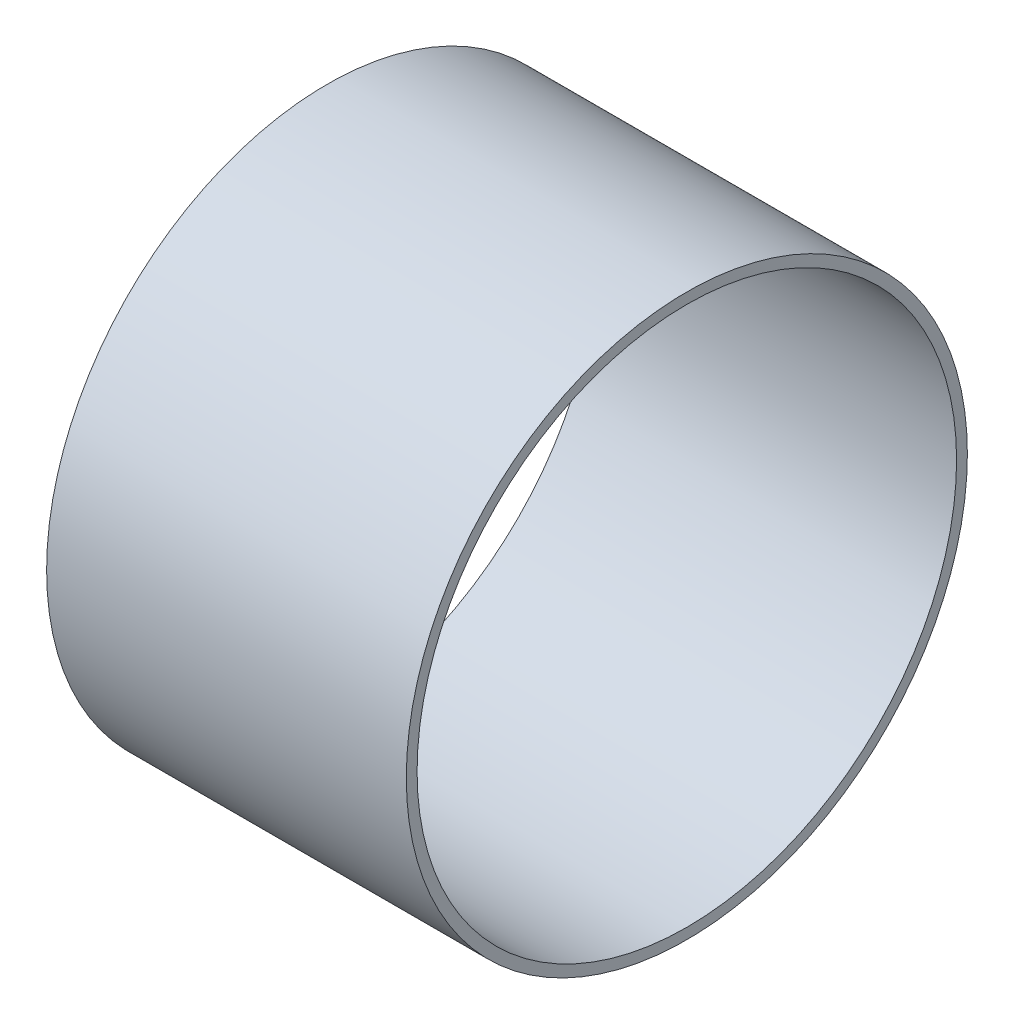
ISO-10303-21;
HEADER;
FILE_DESCRIPTION(('STEP AP214'),'2;1');
FILE_NAME('part.step','',(''),(''),'','','');
FILE_SCHEMA(('AUTOMOTIVE_DESIGN { 1 0 10303 214 1 1 1 1 }'));
ENDSEC;
DATA;
#1=APPLICATION_CONTEXT('core data for automotive mechanical design processes');
#2=APPLICATION_PROTOCOL_DEFINITION('international standard','automotive_design',2000,#1);
#3=PRODUCT_CONTEXT('',#1,'mechanical');
#4=PRODUCT('Part','Part','',(#3));
#5=PRODUCT_RELATED_PRODUCT_CATEGORY('part','',(#4));
#6=PRODUCT_DEFINITION_FORMATION('','',#4);
#7=PRODUCT_DEFINITION_CONTEXT('part definition',#1,'design');
#8=PRODUCT_DEFINITION('design','',#6,#7);
#9=PRODUCT_DEFINITION_SHAPE('','',#8);
#10=(LENGTH_UNIT() NAMED_UNIT(*) SI_UNIT(.MILLI.,.METRE.));
#11=(NAMED_UNIT(*) PLANE_ANGLE_UNIT() SI_UNIT($,.RADIAN.));
#12=(NAMED_UNIT(*) SI_UNIT($,.STERADIAN.) SOLID_ANGLE_UNIT());
#13=UNCERTAINTY_MEASURE_WITH_UNIT(LENGTH_MEASURE(1.E-05),#10,'distance_accuracy_value','');
#14=(GEOMETRIC_REPRESENTATION_CONTEXT(3) GLOBAL_UNCERTAINTY_ASSIGNED_CONTEXT((#13)) GLOBAL_UNIT_ASSIGNED_CONTEXT((#10,
#11,#12)) REPRESENTATION_CONTEXT('',''));
#15=CARTESIAN_POINT('',(0.,0.,0.));
#16=DIRECTION('',(0.,0.,1.));
#17=DIRECTION('',(1.,0.,0.));
#18=AXIS2_PLACEMENT_3D('',#15,#16,#17);
#19=CARTESIAN_POINT('',(50.8,0.,0.));
#20=DIRECTION('',(1.,0.,0.));
#21=DIRECTION('',(0.,0.,-1.));
#22=AXIS2_PLACEMENT_3D('',#19,#20,#21);
#23=PLANE('',#22);
#24=CARTESIAN_POINT('',(50.8,0.,0.));
#25=DIRECTION('',(1.,0.,0.));
#26=DIRECTION('',(0.,0.,-1.));
#27=AXIS2_PLACEMENT_3D('',#24,#25,#26);
#28=CIRCLE('',#27,39.624);
#29=CARTESIAN_POINT('',(50.8,0.,-39.624));
#30=VERTEX_POINT('',#29);
#31=EDGE_CURVE('E10',#30,#30,#28,.T.);
#32=ORIENTED_EDGE('',*,*,#31,.T.);
#33=EDGE_LOOP('',(#32));
#34=FACE_BOUND('',#33,.T.);
#35=CARTESIAN_POINT('',(50.8,0.,0.));
#36=DIRECTION('',(1.,0.,0.));
#37=DIRECTION('',(0.,0.,-1.));
#38=AXIS2_PLACEMENT_3D('',#35,#36,#37);
#39=CIRCLE('',#38,38.1);
#40=CARTESIAN_POINT('',(50.8,0.,-38.1));
#41=VERTEX_POINT('',#40);
#42=EDGE_CURVE('E56',#41,#41,#39,.T.);
#43=ORIENTED_EDGE('',*,*,#42,.F.);
#44=EDGE_LOOP('',(#43));
#45=FACE_BOUND('',#44,.T.);
#46=ADVANCED_FACE('F43',(#34,#45),#23,.T.);
#47=CARTESIAN_POINT('',(0.,0.,0.));
#48=DIRECTION('',(1.,0.,0.));
#49=DIRECTION('',(0.,0.,-1.));
#50=AXIS2_PLACEMENT_3D('',#47,#48,#49);
#51=PLANE('',#50);
#52=CARTESIAN_POINT('',(0.,0.,0.));
#53=DIRECTION('',(1.,0.,0.));
#54=DIRECTION('',(0.,0.,-1.));
#55=AXIS2_PLACEMENT_3D('',#52,#53,#54);
#56=CIRCLE('',#55,39.624);
#57=CARTESIAN_POINT('',(0.,0.,-39.624));
#58=VERTEX_POINT('',#57);
#59=EDGE_CURVE('E47',#58,#58,#56,.T.);
#60=ORIENTED_EDGE('',*,*,#59,.F.);
#61=EDGE_LOOP('',(#60));
#62=FACE_BOUND('',#61,.T.);
#63=CARTESIAN_POINT('',(0.,0.,0.));
#64=DIRECTION('',(1.,0.,0.));
#65=DIRECTION('',(0.,0.,-1.));
#66=AXIS2_PLACEMENT_3D('',#63,#64,#65);
#67=CIRCLE('',#66,38.1);
#68=CARTESIAN_POINT('',(0.,0.,-38.1));
#69=VERTEX_POINT('',#68);
#70=EDGE_CURVE('E58',#69,#69,#67,.T.);
#71=ORIENTED_EDGE('',*,*,#70,.T.);
#72=EDGE_LOOP('',(#71));
#73=FACE_BOUND('',#72,.T.);
#74=ADVANCED_FACE('F70',(#62,#73),#51,.F.);
#75=CARTESIAN_POINT('',(50.8,0.,0.));
#76=DIRECTION('',(-1.,0.,0.));
#77=DIRECTION('',(0.,0.,1.));
#78=AXIS2_PLACEMENT_3D('',#75,#76,#77);
#79=CYLINDRICAL_SURFACE('',#78,39.624);
#80=ORIENTED_EDGE('',*,*,#31,.F.);
#81=EDGE_LOOP('',(#80));
#82=FACE_BOUND('',#81,.T.);
#83=ORIENTED_EDGE('',*,*,#59,.T.);
#84=EDGE_LOOP('',(#83));
#85=FACE_BOUND('',#84,.T.);
#86=ADVANCED_FACE('F45',(#82,#85),#79,.T.);
#87=CARTESIAN_POINT('',(50.8,0.,0.));
#88=DIRECTION('',(-1.,0.,0.));
#89=DIRECTION('',(0.,0.,1.));
#90=AXIS2_PLACEMENT_3D('',#87,#88,#89);
#91=CYLINDRICAL_SURFACE('',#90,38.1);
#92=ORIENTED_EDGE('',*,*,#42,.T.);
#93=EDGE_LOOP('',(#92));
#94=FACE_BOUND('',#93,.T.);
#95=ORIENTED_EDGE('',*,*,#70,.F.);
#96=EDGE_LOOP('',(#95));
#97=FACE_BOUND('',#96,.T.);
#98=ADVANCED_FACE('F66',(#94,#97),#91,.F.);
#99=CLOSED_SHELL('',(#46,#74,#86,#98));
#100=MANIFOLD_SOLID_BREP('B2',#99);
#101=ADVANCED_BREP_SHAPE_REPRESENTATION('',(#18,#100),#14);
#102=SHAPE_DEFINITION_REPRESENTATION(#9,#101);
ENDSEC;
END-ISO-10303-21;
